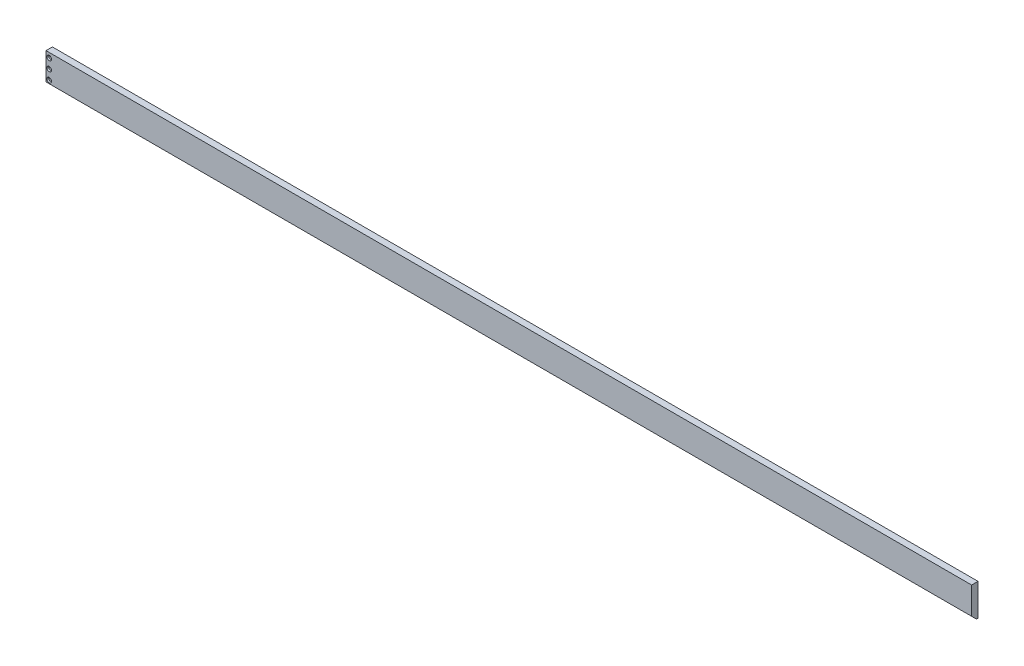
ISO-10303-21;
HEADER;
FILE_DESCRIPTION(('STEP AP214'),'2;1');
FILE_NAME('part.step','',(''),(''),'','','');
FILE_SCHEMA(('AUTOMOTIVE_DESIGN { 1 0 10303 214 1 1 1 1 }'));
ENDSEC;
DATA;
#1=APPLICATION_CONTEXT('core data for automotive mechanical design processes');
#2=APPLICATION_PROTOCOL_DEFINITION('international standard','automotive_design',2000,#1);
#3=PRODUCT_CONTEXT('',#1,'mechanical');
#4=PRODUCT('Part','Part','',(#3));
#5=PRODUCT_RELATED_PRODUCT_CATEGORY('part','',(#4));
#6=PRODUCT_DEFINITION_FORMATION('','',#4);
#7=PRODUCT_DEFINITION_CONTEXT('part definition',#1,'design');
#8=PRODUCT_DEFINITION('design','',#6,#7);
#9=PRODUCT_DEFINITION_SHAPE('','',#8);
#10=(LENGTH_UNIT() NAMED_UNIT(*) SI_UNIT(.MILLI.,.METRE.));
#11=(NAMED_UNIT(*) PLANE_ANGLE_UNIT() SI_UNIT($,.RADIAN.));
#12=(NAMED_UNIT(*) SI_UNIT($,.STERADIAN.) SOLID_ANGLE_UNIT());
#13=UNCERTAINTY_MEASURE_WITH_UNIT(LENGTH_MEASURE(1.E-05),#10,'distance_accuracy_value','');
#14=(GEOMETRIC_REPRESENTATION_CONTEXT(3) GLOBAL_UNCERTAINTY_ASSIGNED_CONTEXT((#13)) GLOBAL_UNIT_ASSIGNED_CONTEXT((#10,
#11,#12)) REPRESENTATION_CONTEXT('',''));
#15=CARTESIAN_POINT('',(0.,0.,0.));
#16=DIRECTION('',(0.,0.,1.));
#17=DIRECTION('',(1.,0.,0.));
#18=AXIS2_PLACEMENT_3D('',#15,#16,#17);
#19=CARTESIAN_POINT('',(1450.,50.,20.));
#20=DIRECTION('',(-1.,0.,0.));
#21=DIRECTION('',(0.,0.,1.));
#22=AXIS2_PLACEMENT_3D('',#19,#20,#21);
#23=PLANE('',#22);
#24=DIRECTION('',(0.,1.,0.));
#25=VECTOR('',#24,1.);
#26=CARTESIAN_POINT('',(1450.,50.,20.));
#27=LINE('',#26,#25);
#28=CARTESIAN_POINT('',(1450.,-34.9999999999999,20.));
#29=VERTEX_POINT('',#28);
#30=CARTESIAN_POINT('',(1450.,50.,20.));
#31=VERTEX_POINT('',#30);
#32=EDGE_CURVE('E85',#29,#31,#27,.T.);
#33=ORIENTED_EDGE('',*,*,#32,.F.);
#34=DIRECTION('',(0.,-0.707106781186548,-0.707106781186548));
#35=VECTOR('',#34,1.);
#36=CARTESIAN_POINT('',(1450.,-34.9999999999999,20.));
#37=LINE('',#36,#35);
#38=CARTESIAN_POINT('',(1450.,-50.,4.99999999999988));
#39=VERTEX_POINT('',#38);
#40=EDGE_CURVE('E62',#29,#39,#37,.T.);
#41=ORIENTED_EDGE('',*,*,#40,.T.);
#42=DIRECTION('',(0.,0.,-1.));
#43=VECTOR('',#42,1.);
#44=CARTESIAN_POINT('',(1450.,-50.,20.));
#45=LINE('',#44,#43);
#46=CARTESIAN_POINT('',(1450.,-50.,0.));
#47=VERTEX_POINT('',#46);
#48=EDGE_CURVE('E192',#39,#47,#45,.T.);
#49=ORIENTED_EDGE('',*,*,#48,.T.);
#50=DIRECTION('',(0.,1.,0.));
#51=VECTOR('',#50,1.);
#52=CARTESIAN_POINT('',(1450.,50.,0.));
#53=LINE('',#52,#51);
#54=CARTESIAN_POINT('',(1450.,50.,0.));
#55=VERTEX_POINT('',#54);
#56=EDGE_CURVE('E107',#47,#55,#53,.T.);
#57=ORIENTED_EDGE('',*,*,#56,.T.);
#58=DIRECTION('',(0.,0.,-1.));
#59=VECTOR('',#58,1.);
#60=CARTESIAN_POINT('',(1450.,50.,20.));
#61=LINE('',#60,#59);
#62=EDGE_CURVE('E99',#31,#55,#61,.T.);
#63=ORIENTED_EDGE('',*,*,#62,.F.);
#64=EDGE_LOOP('',(#33,#41,#49,#57,#63));
#65=FACE_BOUND('',#64,.T.);
#66=ADVANCED_FACE('F38',(#65),#23,.F.);
#67=CARTESIAN_POINT('',(-1450.,50.,20.));
#68=DIRECTION('',(0.,-1.,0.));
#69=DIRECTION('',(0.,0.,-1.));
#70=AXIS2_PLACEMENT_3D('',#67,#68,#69);
#71=PLANE('',#70);
#72=DIRECTION('',(-1.,0.,0.));
#73=VECTOR('',#72,1.);
#74=CARTESIAN_POINT('',(-1450.,50.,0.));
#75=LINE('',#74,#73);
#76=CARTESIAN_POINT('',(-1450.,50.,0.));
#77=VERTEX_POINT('',#76);
#78=EDGE_CURVE('E197',#55,#77,#75,.T.);
#79=ORIENTED_EDGE('',*,*,#78,.T.);
#80=DIRECTION('',(0.,0.,-1.));
#81=VECTOR('',#80,1.);
#82=CARTESIAN_POINT('',(-1450.,50.,20.));
#83=LINE('',#82,#81);
#84=CARTESIAN_POINT('',(-1450.,50.,20.));
#85=VERTEX_POINT('',#84);
#86=EDGE_CURVE('E102',#85,#77,#83,.T.);
#87=ORIENTED_EDGE('',*,*,#86,.F.);
#88=DIRECTION('',(-1.,0.,0.));
#89=VECTOR('',#88,1.);
#90=CARTESIAN_POINT('',(-1450.,50.,20.));
#91=LINE('',#90,#89);
#92=EDGE_CURVE('E89',#31,#85,#91,.T.);
#93=ORIENTED_EDGE('',*,*,#92,.F.);
#94=ORIENTED_EDGE('',*,*,#62,.T.);
#95=EDGE_LOOP('',(#79,#87,#93,#94));
#96=FACE_BOUND('',#95,.T.);
#97=ADVANCED_FACE('F98',(#96),#71,.F.);
#98=CARTESIAN_POINT('',(-1450.,50.,20.));
#99=DIRECTION('',(1.,0.,0.));
#100=DIRECTION('',(0.,0.,-1.));
#101=AXIS2_PLACEMENT_3D('',#98,#99,#100);
#102=PLANE('',#101);
#103=DIRECTION('',(0.,0.,-1.));
#104=VECTOR('',#103,1.);
#105=CARTESIAN_POINT('',(-1450.,-50.,20.));
#106=LINE('',#105,#104);
#107=CARTESIAN_POINT('',(-1450.,-50.,4.99999999999988));
#108=VERTEX_POINT('',#107);
#109=CARTESIAN_POINT('',(-1450.,-50.,0.));
#110=VERTEX_POINT('',#109);
#111=EDGE_CURVE('E110',#108,#110,#106,.T.);
#112=ORIENTED_EDGE('',*,*,#111,.F.);
#113=DIRECTION('',(0.,0.707106781186548,0.707106781186548));
#114=VECTOR('',#113,1.);
#115=CARTESIAN_POINT('',(-1450.,-34.9999999999999,20.));
#116=LINE('',#115,#114);
#117=CARTESIAN_POINT('',(-1450.,-34.9999999999999,20.));
#118=VERTEX_POINT('',#117);
#119=EDGE_CURVE('E116',#108,#118,#116,.T.);
#120=ORIENTED_EDGE('',*,*,#119,.T.);
#121=DIRECTION('',(0.,-1.,0.));
#122=VECTOR('',#121,1.);
#123=CARTESIAN_POINT('',(-1450.,50.,20.));
#124=LINE('',#123,#122);
#125=EDGE_CURVE('E104',#85,#118,#124,.T.);
#126=ORIENTED_EDGE('',*,*,#125,.F.);
#127=ORIENTED_EDGE('',*,*,#86,.T.);
#128=DIRECTION('',(0.,-1.,0.));
#129=VECTOR('',#128,1.);
#130=CARTESIAN_POINT('',(-1450.,50.,0.));
#131=LINE('',#130,#129);
#132=EDGE_CURVE('E199',#77,#110,#131,.T.);
#133=ORIENTED_EDGE('',*,*,#132,.T.);
#134=EDGE_LOOP('',(#112,#120,#126,#127,#133));
#135=FACE_BOUND('',#134,.T.);
#136=ADVANCED_FACE('F163',(#135),#102,.F.);
#137=CARTESIAN_POINT('',(-1450.,-50.,20.));
#138=DIRECTION('',(0.,1.,0.));
#139=DIRECTION('',(0.,0.,1.));
#140=AXIS2_PLACEMENT_3D('',#137,#138,#139);
#141=PLANE('',#140);
#142=ORIENTED_EDGE('',*,*,#48,.F.);
#143=DIRECTION('',(-1.,0.,0.));
#144=VECTOR('',#143,1.);
#145=CARTESIAN_POINT('',(-1450.,-50.,4.99999999999988));
#146=LINE('',#145,#144);
#147=EDGE_CURVE('E54',#39,#108,#146,.T.);
#148=ORIENTED_EDGE('',*,*,#147,.T.);
#149=ORIENTED_EDGE('',*,*,#111,.T.);
#150=DIRECTION('',(1.,0.,0.));
#151=VECTOR('',#150,1.);
#152=CARTESIAN_POINT('',(-1450.,-50.,0.));
#153=LINE('',#152,#151);
#154=EDGE_CURVE('E94',#110,#47,#153,.T.);
#155=ORIENTED_EDGE('',*,*,#154,.T.);
#156=EDGE_LOOP('',(#142,#148,#149,#155));
#157=FACE_BOUND('',#156,.T.);
#158=ADVANCED_FACE('F202',(#157),#141,.F.);
#159=CARTESIAN_POINT('',(0.,0.,20.));
#160=DIRECTION('',(0.,0.,1.));
#161=DIRECTION('',(1.,0.,0.));
#162=AXIS2_PLACEMENT_3D('',#159,#160,#161);
#163=PLANE('',#162);
#164=CARTESIAN_POINT('',(-1440.,-25.,20.));
#165=DIRECTION('',(0.,0.,1.));
#166=DIRECTION('',(1.,0.,0.));
#167=AXIS2_PLACEMENT_3D('',#164,#165,#166);
#168=CIRCLE('',#167,7.25000000000042);
#169=CARTESIAN_POINT('',(-1432.75,-25.,20.));
#170=VERTEX_POINT('',#169);
#171=EDGE_CURVE('E136',#170,#170,#168,.F.);
#172=ORIENTED_EDGE('',*,*,#171,.T.);
#173=EDGE_LOOP('',(#172));
#174=FACE_BOUND('',#173,.T.);
#175=CARTESIAN_POINT('',(-1440.,5.,20.));
#176=DIRECTION('',(0.,0.,1.));
#177=DIRECTION('',(1.,0.,0.));
#178=AXIS2_PLACEMENT_3D('',#175,#176,#177);
#179=CIRCLE('',#178,7.25000000000042);
#180=CARTESIAN_POINT('',(-1432.75,5.,20.));
#181=VERTEX_POINT('',#180);
#182=EDGE_CURVE('E133',#181,#181,#179,.F.);
#183=ORIENTED_EDGE('',*,*,#182,.T.);
#184=EDGE_LOOP('',(#183));
#185=FACE_BOUND('',#184,.T.);
#186=CARTESIAN_POINT('',(-1440.,35.,20.));
#187=DIRECTION('',(0.,0.,1.));
#188=DIRECTION('',(1.,0.,0.));
#189=AXIS2_PLACEMENT_3D('',#186,#187,#188);
#190=CIRCLE('',#189,7.25000000000042);
#191=CARTESIAN_POINT('',(-1432.75,35.,20.));
#192=VERTEX_POINT('',#191);
#193=EDGE_CURVE('E130',#192,#192,#190,.F.);
#194=ORIENTED_EDGE('',*,*,#193,.T.);
#195=EDGE_LOOP('',(#194));
#196=FACE_BOUND('',#195,.T.);
#197=ORIENTED_EDGE('',*,*,#125,.T.);
#198=DIRECTION('',(1.,0.,0.));
#199=VECTOR('',#198,1.);
#200=CARTESIAN_POINT('',(1450.,-34.9999999999999,20.));
#201=LINE('',#200,#199);
#202=EDGE_CURVE('E92',#118,#29,#201,.T.);
#203=ORIENTED_EDGE('',*,*,#202,.T.);
#204=ORIENTED_EDGE('',*,*,#32,.T.);
#205=ORIENTED_EDGE('',*,*,#92,.T.);
#206=EDGE_LOOP('',(#197,#203,#204,#205));
#207=FACE_BOUND('',#206,.T.);
#208=ADVANCED_FACE('F88',(#174,#185,#196,#207),#163,.T.);
#209=CARTESIAN_POINT('',(0.,0.,0.));
#210=DIRECTION('',(0.,0.,1.));
#211=DIRECTION('',(1.,0.,0.));
#212=AXIS2_PLACEMENT_3D('',#209,#210,#211);
#213=PLANE('',#212);
#214=CARTESIAN_POINT('',(-1440.,35.,0.));
#215=DIRECTION('',(0.,0.,1.));
#216=DIRECTION('',(1.,0.,0.));
#217=AXIS2_PLACEMENT_3D('',#214,#215,#216);
#218=CIRCLE('',#217,4.25000000000001);
#219=CARTESIAN_POINT('',(-1435.75,35.,0.));
#220=VERTEX_POINT('',#219);
#221=EDGE_CURVE('E125',#220,#220,#218,.T.);
#222=ORIENTED_EDGE('',*,*,#221,.T.);
#223=EDGE_LOOP('',(#222));
#224=FACE_BOUND('',#223,.T.);
#225=CARTESIAN_POINT('',(-1440.,-25.,0.));
#226=DIRECTION('',(0.,0.,1.));
#227=DIRECTION('',(1.,0.,0.));
#228=AXIS2_PLACEMENT_3D('',#225,#226,#227);
#229=CIRCLE('',#228,4.25000000000001);
#230=CARTESIAN_POINT('',(-1435.75,-25.,0.));
#231=VERTEX_POINT('',#230);
#232=EDGE_CURVE('E122',#231,#231,#229,.T.);
#233=ORIENTED_EDGE('',*,*,#232,.T.);
#234=EDGE_LOOP('',(#233));
#235=FACE_BOUND('',#234,.T.);
#236=CARTESIAN_POINT('',(-1440.,5.,0.));
#237=DIRECTION('',(0.,0.,1.));
#238=DIRECTION('',(1.,0.,0.));
#239=AXIS2_PLACEMENT_3D('',#236,#237,#238);
#240=CIRCLE('',#239,4.25000000000001);
#241=CARTESIAN_POINT('',(-1435.75,5.,0.));
#242=VERTEX_POINT('',#241);
#243=EDGE_CURVE('E119',#242,#242,#240,.T.);
#244=ORIENTED_EDGE('',*,*,#243,.T.);
#245=EDGE_LOOP('',(#244));
#246=FACE_BOUND('',#245,.T.);
#247=ORIENTED_EDGE('',*,*,#56,.F.);
#248=ORIENTED_EDGE('',*,*,#154,.F.);
#249=ORIENTED_EDGE('',*,*,#132,.F.);
#250=ORIENTED_EDGE('',*,*,#78,.F.);
#251=EDGE_LOOP('',(#247,#248,#249,#250));
#252=FACE_BOUND('',#251,.T.);
#253=ADVANCED_FACE('F173',(#224,#235,#246,#252),#213,.F.);
#254=CARTESIAN_POINT('',(0.,-34.9999999999999,20.));
#255=DIRECTION('',(0.,-0.707106781186548,0.707106781186548));
#256=DIRECTION('',(-1.,0.,0.));
#257=AXIS2_PLACEMENT_3D('',#254,#255,#256);
#258=PLANE('',#257);
#259=ORIENTED_EDGE('',*,*,#119,.F.);
#260=ORIENTED_EDGE('',*,*,#147,.F.);
#261=ORIENTED_EDGE('',*,*,#40,.F.);
#262=ORIENTED_EDGE('',*,*,#202,.F.);
#263=EDGE_LOOP('',(#259,#260,#261,#262));
#264=FACE_BOUND('',#263,.T.);
#265=ADVANCED_FACE('F168',(#264),#258,.T.);
#266=CARTESIAN_POINT('',(-1440.,5.,-10.));
#267=DIRECTION('',(0.,0.,1.));
#268=DIRECTION('',(1.,0.,0.));
#269=AXIS2_PLACEMENT_3D('',#266,#267,#268);
#270=CYLINDRICAL_SURFACE('',#269,4.25000000000001);
#271=CARTESIAN_POINT('',(-1440.,5.,16.9999999999996));
#272=DIRECTION('',(0.,0.,1.));
#273=DIRECTION('',(1.,0.,0.));
#274=AXIS2_PLACEMENT_3D('',#271,#272,#273);
#275=CIRCLE('',#274,4.25000000000001);
#276=CARTESIAN_POINT('',(-1435.75,5.,16.9999999999996));
#277=VERTEX_POINT('',#276);
#278=EDGE_CURVE('E47',#277,#277,#275,.T.);
#279=ORIENTED_EDGE('',*,*,#278,.T.);
#280=EDGE_LOOP('',(#279));
#281=FACE_BOUND('',#280,.T.);
#282=ORIENTED_EDGE('',*,*,#243,.F.);
#283=EDGE_LOOP('',(#282));
#284=FACE_BOUND('',#283,.T.);
#285=ADVANCED_FACE('F141',(#281,#284),#270,.F.);
#286=CARTESIAN_POINT('',(-1440.,-25.,-10.));
#287=DIRECTION('',(0.,0.,1.));
#288=DIRECTION('',(1.,0.,0.));
#289=AXIS2_PLACEMENT_3D('',#286,#287,#288);
#290=CYLINDRICAL_SURFACE('',#289,4.25000000000001);
#291=CARTESIAN_POINT('',(-1440.,-25.,16.9999999999996));
#292=DIRECTION('',(0.,0.,1.));
#293=DIRECTION('',(1.,0.,0.));
#294=AXIS2_PLACEMENT_3D('',#291,#292,#293);
#295=CIRCLE('',#294,4.25000000000001);
#296=CARTESIAN_POINT('',(-1435.75,-25.,16.9999999999996));
#297=VERTEX_POINT('',#296);
#298=EDGE_CURVE('E118',#297,#297,#295,.T.);
#299=ORIENTED_EDGE('',*,*,#298,.T.);
#300=EDGE_LOOP('',(#299));
#301=FACE_BOUND('',#300,.T.);
#302=ORIENTED_EDGE('',*,*,#232,.F.);
#303=EDGE_LOOP('',(#302));
#304=FACE_BOUND('',#303,.T.);
#305=ADVANCED_FACE('F185',(#301,#304),#290,.F.);
#306=CARTESIAN_POINT('',(-1440.,35.,-10.));
#307=DIRECTION('',(0.,0.,1.));
#308=DIRECTION('',(1.,0.,0.));
#309=AXIS2_PLACEMENT_3D('',#306,#307,#308);
#310=CYLINDRICAL_SURFACE('',#309,4.25000000000001);
#311=CARTESIAN_POINT('',(-1440.,35.,16.9999999999996));
#312=DIRECTION('',(0.,0.,1.));
#313=DIRECTION('',(1.,0.,0.));
#314=AXIS2_PLACEMENT_3D('',#311,#312,#313);
#315=CIRCLE('',#314,4.25000000000001);
#316=CARTESIAN_POINT('',(-1435.75,35.,16.9999999999996));
#317=VERTEX_POINT('',#316);
#318=EDGE_CURVE('E11',#317,#317,#315,.T.);
#319=ORIENTED_EDGE('',*,*,#318,.T.);
#320=EDGE_LOOP('',(#319));
#321=FACE_BOUND('',#320,.T.);
#322=ORIENTED_EDGE('',*,*,#221,.F.);
#323=EDGE_LOOP('',(#322));
#324=FACE_BOUND('',#323,.T.);
#325=ADVANCED_FACE('F153',(#321,#324),#310,.F.);
#326=CARTESIAN_POINT('',(-1440.,-25.,16.9999999999996));
#327=DIRECTION('',(0.,0.,1.));
#328=DIRECTION('',(1.,0.,0.));
#329=AXIS2_PLACEMENT_3D('',#326,#327,#328);
#330=CONICAL_SURFACE('',#329,4.25000000000001,0.785398163397446);
#331=ORIENTED_EDGE('',*,*,#171,.F.);
#332=EDGE_LOOP('',(#331));
#333=FACE_BOUND('',#332,.T.);
#334=ORIENTED_EDGE('',*,*,#298,.F.);
#335=EDGE_LOOP('',(#334));
#336=FACE_BOUND('',#335,.T.);
#337=ADVANCED_FACE('F146',(#333,#336),#330,.F.);
#338=CARTESIAN_POINT('',(-1440.,5.,16.9999999999996));
#339=DIRECTION('',(0.,0.,1.));
#340=DIRECTION('',(1.,0.,0.));
#341=AXIS2_PLACEMENT_3D('',#338,#339,#340);
#342=CONICAL_SURFACE('',#341,4.25000000000001,0.785398163397446);
#343=ORIENTED_EDGE('',*,*,#182,.F.);
#344=EDGE_LOOP('',(#343));
#345=FACE_BOUND('',#344,.T.);
#346=ORIENTED_EDGE('',*,*,#278,.F.);
#347=EDGE_LOOP('',(#346));
#348=FACE_BOUND('',#347,.T.);
#349=ADVANCED_FACE('F144',(#345,#348),#342,.F.);
#350=CARTESIAN_POINT('',(-1440.,35.,16.9999999999996));
#351=DIRECTION('',(0.,0.,1.));
#352=DIRECTION('',(1.,0.,0.));
#353=AXIS2_PLACEMENT_3D('',#350,#351,#352);
#354=CONICAL_SURFACE('',#353,4.25000000000001,0.785398163397446);
#355=ORIENTED_EDGE('',*,*,#193,.F.);
#356=EDGE_LOOP('',(#355));
#357=FACE_BOUND('',#356,.T.);
#358=ORIENTED_EDGE('',*,*,#318,.F.);
#359=EDGE_LOOP('',(#358));
#360=FACE_BOUND('',#359,.T.);
#361=ADVANCED_FACE('F41',(#357,#360),#354,.F.);
#362=CLOSED_SHELL('',(#66,#97,#136,#158,#208,#253,#265,#285,#305,#325,#337,#349,#361));
#363=MANIFOLD_SOLID_BREP('B2',#362);
#364=ADVANCED_BREP_SHAPE_REPRESENTATION('',(#18,#363),#14);
#365=SHAPE_DEFINITION_REPRESENTATION(#9,#364);
ENDSEC;
END-ISO-10303-21;
